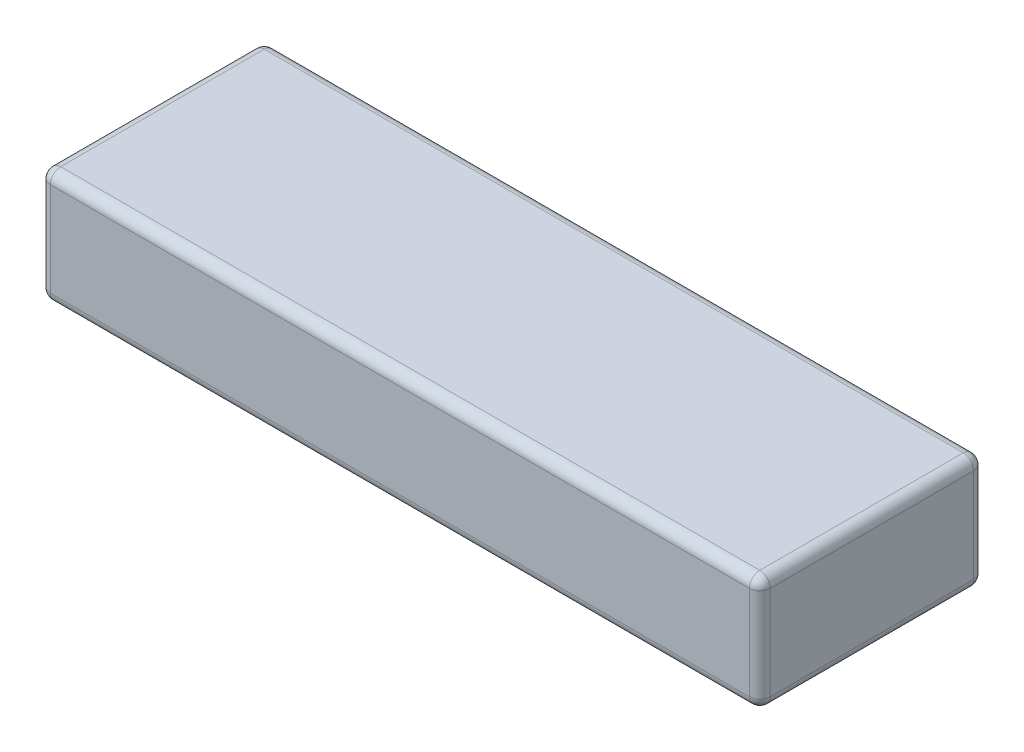
ISO-10303-21;
HEADER;
FILE_DESCRIPTION(('STEP AP214'),'2;1');
FILE_NAME('part.step','',(''),(''),'','','');
FILE_SCHEMA(('AUTOMOTIVE_DESIGN { 1 0 10303 214 1 1 1 1 }'));
ENDSEC;
DATA;
#1=APPLICATION_CONTEXT('core data for automotive mechanical design processes');
#2=APPLICATION_PROTOCOL_DEFINITION('international standard','automotive_design',2000,#1);
#3=PRODUCT_CONTEXT('',#1,'mechanical');
#4=PRODUCT('Part','Part','',(#3));
#5=PRODUCT_RELATED_PRODUCT_CATEGORY('part','',(#4));
#6=PRODUCT_DEFINITION_FORMATION('','',#4);
#7=PRODUCT_DEFINITION_CONTEXT('part definition',#1,'design');
#8=PRODUCT_DEFINITION('design','',#6,#7);
#9=PRODUCT_DEFINITION_SHAPE('','',#8);
#10=(LENGTH_UNIT() NAMED_UNIT(*) SI_UNIT(.MILLI.,.METRE.));
#11=(NAMED_UNIT(*) PLANE_ANGLE_UNIT() SI_UNIT($,.RADIAN.));
#12=(NAMED_UNIT(*) SI_UNIT($,.STERADIAN.) SOLID_ANGLE_UNIT());
#13=UNCERTAINTY_MEASURE_WITH_UNIT(LENGTH_MEASURE(1.E-05),#10,'distance_accuracy_value','');
#14=(GEOMETRIC_REPRESENTATION_CONTEXT(3) GLOBAL_UNCERTAINTY_ASSIGNED_CONTEXT((#13)) GLOBAL_UNIT_ASSIGNED_CONTEXT((#10,
#11,#12)) REPRESENTATION_CONTEXT('',''));
#15=CARTESIAN_POINT('',(0.,0.,0.));
#16=DIRECTION('',(0.,0.,1.));
#17=DIRECTION('',(1.,0.,0.));
#18=AXIS2_PLACEMENT_3D('',#15,#16,#17);
#19=CARTESIAN_POINT('',(69.,22.,21.5));
#20=DIRECTION('',(-1.,0.,0.));
#21=DIRECTION('',(0.,0.,1.));
#22=AXIS2_PLACEMENT_3D('',#19,#20,#21);
#23=PLANE('',#22);
#24=DIRECTION('',(0.,-1.,0.));
#25=VECTOR('',#24,1.);
#26=CARTESIAN_POINT('',(69.,22.,19.5));
#27=LINE('',#26,#25);
#28=CARTESIAN_POINT('',(69.,20.,19.5));
#29=VERTEX_POINT('',#28);
#30=CARTESIAN_POINT('',(69.,2.,19.5));
#31=VERTEX_POINT('',#30);
#32=EDGE_CURVE('E133',#29,#31,#27,.T.);
#33=ORIENTED_EDGE('',*,*,#32,.T.);
#34=DIRECTION('',(0.,0.,-1.));
#35=VECTOR('',#34,1.);
#36=CARTESIAN_POINT('',(69.,2.,-21.5));
#37=LINE('',#36,#35);
#38=CARTESIAN_POINT('',(69.,2.,-19.5));
#39=VERTEX_POINT('',#38);
#40=EDGE_CURVE('E129',#31,#39,#37,.T.);
#41=ORIENTED_EDGE('',*,*,#40,.T.);
#42=DIRECTION('',(0.,-1.,0.));
#43=VECTOR('',#42,1.);
#44=CARTESIAN_POINT('',(69.,22.,-19.5));
#45=LINE('',#44,#43);
#46=CARTESIAN_POINT('',(69.,20.,-19.5));
#47=VERTEX_POINT('',#46);
#48=EDGE_CURVE('E124',#39,#47,#45,.F.);
#49=ORIENTED_EDGE('',*,*,#48,.T.);
#50=DIRECTION('',(0.,0.,-1.));
#51=VECTOR('',#50,1.);
#52=CARTESIAN_POINT('',(69.,20.,21.5));
#53=LINE('',#52,#51);
#54=EDGE_CURVE('E126',#47,#29,#53,.F.);
#55=ORIENTED_EDGE('',*,*,#54,.T.);
#56=EDGE_LOOP('',(#33,#41,#49,#55));
#57=FACE_BOUND('',#56,.T.);
#58=ADVANCED_FACE('F32',(#57),#23,.F.);
#59=CARTESIAN_POINT('',(-69.,22.,-21.5));
#60=DIRECTION('',(0.,0.,1.));
#61=DIRECTION('',(1.,0.,0.));
#62=AXIS2_PLACEMENT_3D('',#59,#60,#61);
#63=PLANE('',#62);
#64=DIRECTION('',(0.,-1.,0.));
#65=VECTOR('',#64,1.);
#66=CARTESIAN_POINT('',(67.,22.,-21.5));
#67=LINE('',#66,#65);
#68=CARTESIAN_POINT('',(67.,20.,-21.5));
#69=VERTEX_POINT('',#68);
#70=CARTESIAN_POINT('',(67.,2.,-21.5));
#71=VERTEX_POINT('',#70);
#72=EDGE_CURVE('E148',#69,#71,#67,.T.);
#73=ORIENTED_EDGE('',*,*,#72,.T.);
#74=DIRECTION('',(-1.,0.,0.));
#75=VECTOR('',#74,1.);
#76=CARTESIAN_POINT('',(-69.,2.,-21.5));
#77=LINE('',#76,#75);
#78=CARTESIAN_POINT('',(-67.,2.,-21.5));
#79=VERTEX_POINT('',#78);
#80=EDGE_CURVE('E272',#71,#79,#77,.T.);
#81=ORIENTED_EDGE('',*,*,#80,.T.);
#82=DIRECTION('',(0.,-1.,0.));
#83=VECTOR('',#82,1.);
#84=CARTESIAN_POINT('',(-67.,22.,-21.5));
#85=LINE('',#84,#83);
#86=CARTESIAN_POINT('',(-67.,20.,-21.5));
#87=VERTEX_POINT('',#86);
#88=EDGE_CURVE('E270',#79,#87,#85,.F.);
#89=ORIENTED_EDGE('',*,*,#88,.T.);
#90=DIRECTION('',(-1.,0.,0.));
#91=VECTOR('',#90,1.);
#92=CARTESIAN_POINT('',(-69.,20.,-21.5));
#93=LINE('',#92,#91);
#94=EDGE_CURVE('E263',#87,#69,#93,.F.);
#95=ORIENTED_EDGE('',*,*,#94,.T.);
#96=EDGE_LOOP('',(#73,#81,#89,#95));
#97=FACE_BOUND('',#96,.T.);
#98=ADVANCED_FACE('F315',(#97),#63,.F.);
#99=CARTESIAN_POINT('',(-69.,22.,21.5));
#100=DIRECTION('',(1.,0.,0.));
#101=DIRECTION('',(0.,0.,-1.));
#102=AXIS2_PLACEMENT_3D('',#99,#100,#101);
#103=PLANE('',#102);
#104=DIRECTION('',(0.,-1.,0.));
#105=VECTOR('',#104,1.);
#106=CARTESIAN_POINT('',(-69.,22.,-19.5));
#107=LINE('',#106,#105);
#108=CARTESIAN_POINT('',(-69.,20.,-19.5));
#109=VERTEX_POINT('',#108);
#110=CARTESIAN_POINT('',(-69.,2.,-19.5));
#111=VERTEX_POINT('',#110);
#112=EDGE_CURVE('E277',#109,#111,#107,.T.);
#113=ORIENTED_EDGE('',*,*,#112,.T.);
#114=DIRECTION('',(0.,0.,1.));
#115=VECTOR('',#114,1.);
#116=CARTESIAN_POINT('',(-69.,2.,21.5));
#117=LINE('',#116,#115);
#118=CARTESIAN_POINT('',(-69.,2.,19.5));
#119=VERTEX_POINT('',#118);
#120=EDGE_CURVE('E280',#111,#119,#117,.T.);
#121=ORIENTED_EDGE('',*,*,#120,.T.);
#122=DIRECTION('',(0.,-1.,0.));
#123=VECTOR('',#122,1.);
#124=CARTESIAN_POINT('',(-69.,22.,19.5));
#125=LINE('',#124,#123);
#126=CARTESIAN_POINT('',(-69.,20.,19.5));
#127=VERTEX_POINT('',#126);
#128=EDGE_CURVE('E208',#119,#127,#125,.F.);
#129=ORIENTED_EDGE('',*,*,#128,.T.);
#130=DIRECTION('',(0.,0.,1.));
#131=VECTOR('',#130,1.);
#132=CARTESIAN_POINT('',(-69.,20.,21.5));
#133=LINE('',#132,#131);
#134=EDGE_CURVE('E275',#127,#109,#133,.F.);
#135=ORIENTED_EDGE('',*,*,#134,.T.);
#136=EDGE_LOOP('',(#113,#121,#129,#135));
#137=FACE_BOUND('',#136,.T.);
#138=ADVANCED_FACE('F296',(#137),#103,.F.);
#139=CARTESIAN_POINT('',(-69.,22.,21.5));
#140=DIRECTION('',(0.,0.,-1.));
#141=DIRECTION('',(-1.,0.,0.));
#142=AXIS2_PLACEMENT_3D('',#139,#140,#141);
#143=PLANE('',#142);
#144=DIRECTION('',(0.,-1.,0.));
#145=VECTOR('',#144,1.);
#146=CARTESIAN_POINT('',(-67.,22.,21.5));
#147=LINE('',#146,#145);
#148=CARTESIAN_POINT('',(-67.,20.,21.5));
#149=VERTEX_POINT('',#148);
#150=CARTESIAN_POINT('',(-67.,2.,21.5));
#151=VERTEX_POINT('',#150);
#152=EDGE_CURVE('E210',#149,#151,#147,.T.);
#153=ORIENTED_EDGE('',*,*,#152,.T.);
#154=DIRECTION('',(1.,0.,0.));
#155=VECTOR('',#154,1.);
#156=CARTESIAN_POINT('',(69.,2.,21.5));
#157=LINE('',#156,#155);
#158=CARTESIAN_POINT('',(67.,2.,21.5));
#159=VERTEX_POINT('',#158);
#160=EDGE_CURVE('E214',#151,#159,#157,.T.);
#161=ORIENTED_EDGE('',*,*,#160,.T.);
#162=DIRECTION('',(0.,-1.,0.));
#163=VECTOR('',#162,1.);
#164=CARTESIAN_POINT('',(67.,22.,21.5));
#165=LINE('',#164,#163);
#166=CARTESIAN_POINT('',(67.,20.,21.5));
#167=VERTEX_POINT('',#166);
#168=EDGE_CURVE('E215',#159,#167,#165,.F.);
#169=ORIENTED_EDGE('',*,*,#168,.T.);
#170=DIRECTION('',(1.,0.,0.));
#171=VECTOR('',#170,1.);
#172=CARTESIAN_POINT('',(-69.,20.,21.5));
#173=LINE('',#172,#171);
#174=EDGE_CURVE('E219',#167,#149,#173,.F.);
#175=ORIENTED_EDGE('',*,*,#174,.T.);
#176=EDGE_LOOP('',(#153,#161,#169,#175));
#177=FACE_BOUND('',#176,.T.);
#178=ADVANCED_FACE('F282',(#177),#143,.F.);
#179=CARTESIAN_POINT('',(0.,22.,0.));
#180=DIRECTION('',(0.,-1.,0.));
#181=DIRECTION('',(0.,0.,-1.));
#182=AXIS2_PLACEMENT_3D('',#179,#180,#181);
#183=PLANE('',#182);
#184=DIRECTION('',(1.,0.,0.));
#185=VECTOR('',#184,1.);
#186=CARTESIAN_POINT('',(0.,22.,19.5));
#187=LINE('',#186,#185);
#188=CARTESIAN_POINT('',(-67.,22.,19.5));
#189=VERTEX_POINT('',#188);
#190=CARTESIAN_POINT('',(67.,22.,19.5));
#191=VERTEX_POINT('',#190);
#192=EDGE_CURVE('E217',#189,#191,#187,.T.);
#193=ORIENTED_EDGE('',*,*,#192,.T.);
#194=DIRECTION('',(0.,0.,-1.));
#195=VECTOR('',#194,1.);
#196=CARTESIAN_POINT('',(67.,22.,0.));
#197=LINE('',#196,#195);
#198=CARTESIAN_POINT('',(67.,22.,-19.5));
#199=VERTEX_POINT('',#198);
#200=EDGE_CURVE('E11',#191,#199,#197,.T.);
#201=ORIENTED_EDGE('',*,*,#200,.T.);
#202=DIRECTION('',(-1.,0.,0.));
#203=VECTOR('',#202,1.);
#204=CARTESIAN_POINT('',(0.,22.,-19.5));
#205=LINE('',#204,#203);
#206=CARTESIAN_POINT('',(-67.,22.,-19.5));
#207=VERTEX_POINT('',#206);
#208=EDGE_CURVE('E41',#199,#207,#205,.T.);
#209=ORIENTED_EDGE('',*,*,#208,.T.);
#210=DIRECTION('',(0.,0.,1.));
#211=VECTOR('',#210,1.);
#212=CARTESIAN_POINT('',(-67.,22.,0.));
#213=LINE('',#212,#211);
#214=EDGE_CURVE('E224',#207,#189,#213,.T.);
#215=ORIENTED_EDGE('',*,*,#214,.T.);
#216=EDGE_LOOP('',(#193,#201,#209,#215));
#217=FACE_BOUND('',#216,.T.);
#218=ADVANCED_FACE('F286',(#217),#183,.F.);
#219=CARTESIAN_POINT('',(0.,0.,0.));
#220=DIRECTION('',(0.,-1.,0.));
#221=DIRECTION('',(0.,0.,-1.));
#222=AXIS2_PLACEMENT_3D('',#219,#220,#221);
#223=PLANE('',#222);
#224=DIRECTION('',(-1.,0.,0.));
#225=VECTOR('',#224,1.);
#226=CARTESIAN_POINT('',(69.,0.,-19.5));
#227=LINE('',#226,#225);
#228=CARTESIAN_POINT('',(-67.,0.,-19.5));
#229=VERTEX_POINT('',#228);
#230=CARTESIAN_POINT('',(67.,0.,-19.5));
#231=VERTEX_POINT('',#230);
#232=EDGE_CURVE('E259',#229,#231,#227,.F.);
#233=ORIENTED_EDGE('',*,*,#232,.T.);
#234=DIRECTION('',(0.,0.,-1.));
#235=VECTOR('',#234,1.);
#236=CARTESIAN_POINT('',(67.,0.,21.5));
#237=LINE('',#236,#235);
#238=CARTESIAN_POINT('',(67.,0.,19.5));
#239=VERTEX_POINT('',#238);
#240=EDGE_CURVE('E256',#231,#239,#237,.F.);
#241=ORIENTED_EDGE('',*,*,#240,.T.);
#242=DIRECTION('',(1.,0.,0.));
#243=VECTOR('',#242,1.);
#244=CARTESIAN_POINT('',(-69.,0.,19.5));
#245=LINE('',#244,#243);
#246=CARTESIAN_POINT('',(-67.,0.,19.5));
#247=VERTEX_POINT('',#246);
#248=EDGE_CURVE('E248',#239,#247,#245,.F.);
#249=ORIENTED_EDGE('',*,*,#248,.T.);
#250=DIRECTION('',(0.,0.,1.));
#251=VECTOR('',#250,1.);
#252=CARTESIAN_POINT('',(-67.,0.,-21.5));
#253=LINE('',#252,#251);
#254=EDGE_CURVE('E253',#247,#229,#253,.F.);
#255=ORIENTED_EDGE('',*,*,#254,.T.);
#256=EDGE_LOOP('',(#233,#241,#249,#255));
#257=FACE_BOUND('',#256,.T.);
#258=ADVANCED_FACE('F257',(#257),#223,.T.);
#259=CARTESIAN_POINT('',(-67.,20.,0.));
#260=DIRECTION('',(0.,0.,1.));
#261=DIRECTION('',(1.,0.,0.));
#262=AXIS2_PLACEMENT_3D('',#259,#260,#261);
#263=CYLINDRICAL_SURFACE('',#262,2.);
#264=CARTESIAN_POINT('',(-67.,20.,19.5));
#265=DIRECTION('',(0.,0.,1.));
#266=DIRECTION('',(1.,0.,0.));
#267=AXIS2_PLACEMENT_3D('',#264,#265,#266);
#268=CIRCLE('',#267,2.);
#269=EDGE_CURVE('E36',#189,#127,#268,.T.);
#270=ORIENTED_EDGE('',*,*,#269,.F.);
#271=ORIENTED_EDGE('',*,*,#214,.F.);
#272=CARTESIAN_POINT('',(-67.,20.,-19.5));
#273=DIRECTION('',(0.,0.,-1.));
#274=DIRECTION('',(-1.,0.,0.));
#275=AXIS2_PLACEMENT_3D('',#272,#273,#274);
#276=CIRCLE('',#275,2.);
#277=EDGE_CURVE('E188',#109,#207,#276,.T.);
#278=ORIENTED_EDGE('',*,*,#277,.F.);
#279=ORIENTED_EDGE('',*,*,#134,.F.);
#280=EDGE_LOOP('',(#270,#271,#278,#279));
#281=FACE_BOUND('',#280,.T.);
#282=ADVANCED_FACE('F34',(#281),#263,.T.);
#283=CARTESIAN_POINT('',(-67.,20.,19.5));
#284=DIRECTION('',(0.,0.,1.));
#285=DIRECTION('',(1.,0.,0.));
#286=AXIS2_PLACEMENT_3D('',#283,#284,#285);
#287=SPHERICAL_SURFACE('',#286,2.);
#288=CARTESIAN_POINT('',(-67.,20.,19.5));
#289=DIRECTION('',(-1.,0.,0.));
#290=DIRECTION('',(0.,0.,1.));
#291=AXIS2_PLACEMENT_3D('',#288,#289,#290);
#292=CIRCLE('',#291,2.);
#293=EDGE_CURVE('E183',#189,#149,#292,.F.);
#294=ORIENTED_EDGE('',*,*,#293,.F.);
#295=ORIENTED_EDGE('',*,*,#269,.T.);
#296=CARTESIAN_POINT('',(-67.,20.,19.5));
#297=DIRECTION('',(0.,1.,0.));
#298=DIRECTION('',(0.,0.,1.));
#299=AXIS2_PLACEMENT_3D('',#296,#297,#298);
#300=CIRCLE('',#299,2.);
#301=EDGE_CURVE('E186',#149,#127,#300,.F.);
#302=ORIENTED_EDGE('',*,*,#301,.F.);
#303=EDGE_LOOP('',(#294,#295,#302));
#304=FACE_BOUND('',#303,.T.);
#305=ADVANCED_FACE('F199',(#304),#287,.T.);
#306=CARTESIAN_POINT('',(-67.,20.,-19.5));
#307=DIRECTION('',(0.,0.,1.));
#308=DIRECTION('',(1.,0.,0.));
#309=AXIS2_PLACEMENT_3D('',#306,#307,#308);
#310=SPHERICAL_SURFACE('',#309,2.);
#311=CARTESIAN_POINT('',(-67.,20.,-19.5));
#312=DIRECTION('',(0.,1.,0.));
#313=DIRECTION('',(0.,0.,1.));
#314=AXIS2_PLACEMENT_3D('',#311,#312,#313);
#315=CIRCLE('',#314,2.);
#316=EDGE_CURVE('E177',#109,#87,#315,.F.);
#317=ORIENTED_EDGE('',*,*,#316,.F.);
#318=ORIENTED_EDGE('',*,*,#277,.T.);
#319=CARTESIAN_POINT('',(-67.,20.,-19.5));
#320=DIRECTION('',(-1.,0.,0.));
#321=DIRECTION('',(0.,0.,1.));
#322=AXIS2_PLACEMENT_3D('',#319,#320,#321);
#323=CIRCLE('',#322,2.);
#324=EDGE_CURVE('E180',#87,#207,#323,.F.);
#325=ORIENTED_EDGE('',*,*,#324,.F.);
#326=EDGE_LOOP('',(#317,#318,#325));
#327=FACE_BOUND('',#326,.T.);
#328=ADVANCED_FACE('F288',(#327),#310,.T.);
#329=CARTESIAN_POINT('',(-67.,22.,19.5));
#330=DIRECTION('',(0.,-1.,0.));
#331=DIRECTION('',(0.,0.,-1.));
#332=AXIS2_PLACEMENT_3D('',#329,#330,#331);
#333=CYLINDRICAL_SURFACE('',#332,2.);
#334=ORIENTED_EDGE('',*,*,#301,.T.);
#335=ORIENTED_EDGE('',*,*,#128,.F.);
#336=CARTESIAN_POINT('',(-67.,2.,19.5));
#337=DIRECTION('',(0.,-1.,0.));
#338=DIRECTION('',(0.,0.,-1.));
#339=AXIS2_PLACEMENT_3D('',#336,#337,#338);
#340=CIRCLE('',#339,2.);
#341=EDGE_CURVE('E172',#151,#119,#340,.T.);
#342=ORIENTED_EDGE('',*,*,#341,.F.);
#343=ORIENTED_EDGE('',*,*,#152,.F.);
#344=EDGE_LOOP('',(#334,#335,#342,#343));
#345=FACE_BOUND('',#344,.T.);
#346=ADVANCED_FACE('F206',(#345),#333,.T.);
#347=CARTESIAN_POINT('',(0.,20.,19.5));
#348=DIRECTION('',(1.,0.,0.));
#349=DIRECTION('',(0.,0.,-1.));
#350=AXIS2_PLACEMENT_3D('',#347,#348,#349);
#351=CYLINDRICAL_SURFACE('',#350,2.);
#352=ORIENTED_EDGE('',*,*,#293,.T.);
#353=ORIENTED_EDGE('',*,*,#174,.F.);
#354=CARTESIAN_POINT('',(67.,20.,19.5));
#355=DIRECTION('',(1.,0.,0.));
#356=DIRECTION('',(0.,0.,-1.));
#357=AXIS2_PLACEMENT_3D('',#354,#355,#356);
#358=CIRCLE('',#357,2.);
#359=EDGE_CURVE('E169',#191,#167,#358,.T.);
#360=ORIENTED_EDGE('',*,*,#359,.F.);
#361=ORIENTED_EDGE('',*,*,#192,.F.);
#362=EDGE_LOOP('',(#352,#353,#360,#361));
#363=FACE_BOUND('',#362,.T.);
#364=ADVANCED_FACE('F285',(#363),#351,.T.);
#365=CARTESIAN_POINT('',(67.,20.,0.));
#366=DIRECTION('',(0.,0.,-1.));
#367=DIRECTION('',(-1.,0.,0.));
#368=AXIS2_PLACEMENT_3D('',#365,#366,#367);
#369=CYLINDRICAL_SURFACE('',#368,2.);
#370=CARTESIAN_POINT('',(67.,20.,-19.5));
#371=DIRECTION('',(0.,0.,-1.));
#372=DIRECTION('',(-1.,0.,0.));
#373=AXIS2_PLACEMENT_3D('',#370,#371,#372);
#374=CIRCLE('',#373,2.);
#375=EDGE_CURVE('E138',#199,#47,#374,.T.);
#376=ORIENTED_EDGE('',*,*,#375,.F.);
#377=ORIENTED_EDGE('',*,*,#200,.F.);
#378=CARTESIAN_POINT('',(67.,20.,19.5));
#379=DIRECTION('',(0.,0.,1.));
#380=DIRECTION('',(1.,0.,0.));
#381=AXIS2_PLACEMENT_3D('',#378,#379,#380);
#382=CIRCLE('',#381,2.);
#383=EDGE_CURVE('E140',#29,#191,#382,.T.);
#384=ORIENTED_EDGE('',*,*,#383,.F.);
#385=ORIENTED_EDGE('',*,*,#54,.F.);
#386=EDGE_LOOP('',(#376,#377,#384,#385));
#387=FACE_BOUND('',#386,.T.);
#388=ADVANCED_FACE('F136',(#387),#369,.T.);
#389=CARTESIAN_POINT('',(0.,20.,-19.5));
#390=DIRECTION('',(-1.,0.,0.));
#391=DIRECTION('',(0.,0.,1.));
#392=AXIS2_PLACEMENT_3D('',#389,#390,#391);
#393=CYLINDRICAL_SURFACE('',#392,2.);
#394=ORIENTED_EDGE('',*,*,#324,.T.);
#395=ORIENTED_EDGE('',*,*,#208,.F.);
#396=CARTESIAN_POINT('',(67.,20.,-19.5));
#397=DIRECTION('',(1.,0.,0.));
#398=DIRECTION('',(0.,0.,-1.));
#399=AXIS2_PLACEMENT_3D('',#396,#397,#398);
#400=CIRCLE('',#399,2.);
#401=EDGE_CURVE('E49',#69,#199,#400,.T.);
#402=ORIENTED_EDGE('',*,*,#401,.F.);
#403=ORIENTED_EDGE('',*,*,#94,.F.);
#404=EDGE_LOOP('',(#394,#395,#402,#403));
#405=FACE_BOUND('',#404,.T.);
#406=ADVANCED_FACE('F425',(#405),#393,.T.);
#407=CARTESIAN_POINT('',(-67.,22.,-19.5));
#408=DIRECTION('',(0.,-1.,0.));
#409=DIRECTION('',(0.,0.,-1.));
#410=AXIS2_PLACEMENT_3D('',#407,#408,#409);
#411=CYLINDRICAL_SURFACE('',#410,2.);
#412=ORIENTED_EDGE('',*,*,#316,.T.);
#413=ORIENTED_EDGE('',*,*,#88,.F.);
#414=CARTESIAN_POINT('',(-67.,2.,-19.5));
#415=DIRECTION('',(0.,-1.,0.));
#416=DIRECTION('',(0.,0.,-1.));
#417=AXIS2_PLACEMENT_3D('',#414,#415,#416);
#418=CIRCLE('',#417,2.);
#419=EDGE_CURVE('E164',#111,#79,#418,.T.);
#420=ORIENTED_EDGE('',*,*,#419,.F.);
#421=ORIENTED_EDGE('',*,*,#112,.F.);
#422=EDGE_LOOP('',(#412,#413,#420,#421));
#423=FACE_BOUND('',#422,.T.);
#424=ADVANCED_FACE('F293',(#423),#411,.T.);
#425=CARTESIAN_POINT('',(-67.,2.,21.5));
#426=DIRECTION('',(0.,0.,-1.));
#427=DIRECTION('',(-1.,0.,0.));
#428=AXIS2_PLACEMENT_3D('',#425,#426,#427);
#429=CYLINDRICAL_SURFACE('',#428,2.);
#430=CARTESIAN_POINT('',(-67.,2.,19.5));
#431=DIRECTION('',(0.,0.,1.));
#432=DIRECTION('',(1.,0.,0.));
#433=AXIS2_PLACEMENT_3D('',#430,#431,#432);
#434=CIRCLE('',#433,2.);
#435=EDGE_CURVE('E174',#119,#247,#434,.T.);
#436=ORIENTED_EDGE('',*,*,#435,.F.);
#437=ORIENTED_EDGE('',*,*,#120,.F.);
#438=CARTESIAN_POINT('',(-67.,2.,-19.5));
#439=DIRECTION('',(0.,0.,-1.));
#440=DIRECTION('',(-1.,0.,0.));
#441=AXIS2_PLACEMENT_3D('',#438,#439,#440);
#442=CIRCLE('',#441,2.);
#443=EDGE_CURVE('E161',#229,#111,#442,.T.);
#444=ORIENTED_EDGE('',*,*,#443,.F.);
#445=ORIENTED_EDGE('',*,*,#254,.F.);
#446=EDGE_LOOP('',(#436,#437,#444,#445));
#447=FACE_BOUND('',#446,.T.);
#448=ADVANCED_FACE('F300',(#447),#429,.T.);
#449=CARTESIAN_POINT('',(-67.,2.,19.5));
#450=DIRECTION('',(0.,0.,1.));
#451=DIRECTION('',(1.,0.,0.));
#452=AXIS2_PLACEMENT_3D('',#449,#450,#451);
#453=SPHERICAL_SURFACE('',#452,2.);
#454=ORIENTED_EDGE('',*,*,#341,.T.);
#455=ORIENTED_EDGE('',*,*,#435,.T.);
#456=CARTESIAN_POINT('',(-67.,2.,19.5));
#457=DIRECTION('',(-1.,0.,0.));
#458=DIRECTION('',(0.,0.,1.));
#459=AXIS2_PLACEMENT_3D('',#456,#457,#458);
#460=CIRCLE('',#459,2.);
#461=EDGE_CURVE('E153',#151,#247,#460,.F.);
#462=ORIENTED_EDGE('',*,*,#461,.F.);
#463=EDGE_LOOP('',(#454,#455,#462));
#464=FACE_BOUND('',#463,.T.);
#465=ADVANCED_FACE('F303',(#464),#453,.T.);
#466=CARTESIAN_POINT('',(67.,20.,19.5));
#467=DIRECTION('',(0.,0.,1.));
#468=DIRECTION('',(1.,0.,0.));
#469=AXIS2_PLACEMENT_3D('',#466,#467,#468);
#470=SPHERICAL_SURFACE('',#469,2.);
#471=ORIENTED_EDGE('',*,*,#383,.T.);
#472=ORIENTED_EDGE('',*,*,#359,.T.);
#473=CARTESIAN_POINT('',(67.,20.,19.5));
#474=DIRECTION('',(0.,1.,0.));
#475=DIRECTION('',(0.,0.,1.));
#476=AXIS2_PLACEMENT_3D('',#473,#474,#475);
#477=CIRCLE('',#476,2.);
#478=EDGE_CURVE('E149',#29,#167,#477,.F.);
#479=ORIENTED_EDGE('',*,*,#478,.F.);
#480=EDGE_LOOP('',(#471,#472,#479));
#481=FACE_BOUND('',#480,.T.);
#482=ADVANCED_FACE('F305',(#481),#470,.T.);
#483=CARTESIAN_POINT('',(67.,20.,-19.5));
#484=DIRECTION('',(0.,0.,1.));
#485=DIRECTION('',(1.,0.,0.));
#486=AXIS2_PLACEMENT_3D('',#483,#484,#485);
#487=SPHERICAL_SURFACE('',#486,2.);
#488=ORIENTED_EDGE('',*,*,#401,.T.);
#489=ORIENTED_EDGE('',*,*,#375,.T.);
#490=CARTESIAN_POINT('',(67.,20.,-19.5));
#491=DIRECTION('',(0.,1.,0.));
#492=DIRECTION('',(0.,0.,1.));
#493=AXIS2_PLACEMENT_3D('',#490,#491,#492);
#494=CIRCLE('',#493,2.);
#495=EDGE_CURVE('E144',#69,#47,#494,.F.);
#496=ORIENTED_EDGE('',*,*,#495,.F.);
#497=EDGE_LOOP('',(#488,#489,#496));
#498=FACE_BOUND('',#497,.T.);
#499=ADVANCED_FACE('F143',(#498),#487,.T.);
#500=CARTESIAN_POINT('',(-67.,2.,-19.5));
#501=DIRECTION('',(0.,0.,1.));
#502=DIRECTION('',(1.,0.,0.));
#503=AXIS2_PLACEMENT_3D('',#500,#501,#502);
#504=SPHERICAL_SURFACE('',#503,2.);
#505=ORIENTED_EDGE('',*,*,#443,.T.);
#506=ORIENTED_EDGE('',*,*,#419,.T.);
#507=CARTESIAN_POINT('',(-67.,2.,-19.5));
#508=DIRECTION('',(-1.,0.,0.));
#509=DIRECTION('',(0.,0.,1.));
#510=AXIS2_PLACEMENT_3D('',#507,#508,#509);
#511=CIRCLE('',#510,2.);
#512=EDGE_CURVE('E150',#229,#79,#511,.F.);
#513=ORIENTED_EDGE('',*,*,#512,.F.);
#514=EDGE_LOOP('',(#505,#506,#513));
#515=FACE_BOUND('',#514,.T.);
#516=ADVANCED_FACE('F345',(#515),#504,.T.);
#517=CARTESIAN_POINT('',(-69.,2.,19.5));
#518=DIRECTION('',(-1.,0.,0.));
#519=DIRECTION('',(0.,0.,1.));
#520=AXIS2_PLACEMENT_3D('',#517,#518,#519);
#521=CYLINDRICAL_SURFACE('',#520,2.);
#522=ORIENTED_EDGE('',*,*,#461,.T.);
#523=ORIENTED_EDGE('',*,*,#248,.F.);
#524=CARTESIAN_POINT('',(67.,2.,19.5));
#525=DIRECTION('',(1.,0.,0.));
#526=DIRECTION('',(0.,0.,-1.));
#527=AXIS2_PLACEMENT_3D('',#524,#525,#526);
#528=CIRCLE('',#527,2.);
#529=EDGE_CURVE('E155',#159,#239,#528,.T.);
#530=ORIENTED_EDGE('',*,*,#529,.F.);
#531=ORIENTED_EDGE('',*,*,#160,.F.);
#532=EDGE_LOOP('',(#522,#523,#530,#531));
#533=FACE_BOUND('',#532,.T.);
#534=ADVANCED_FACE('F250',(#533),#521,.T.);
#535=CARTESIAN_POINT('',(67.,22.,19.5));
#536=DIRECTION('',(0.,-1.,0.));
#537=DIRECTION('',(0.,0.,-1.));
#538=AXIS2_PLACEMENT_3D('',#535,#536,#537);
#539=CYLINDRICAL_SURFACE('',#538,2.);
#540=ORIENTED_EDGE('',*,*,#478,.T.);
#541=ORIENTED_EDGE('',*,*,#168,.F.);
#542=CARTESIAN_POINT('',(67.,2.,19.5));
#543=DIRECTION('',(0.,-1.,0.));
#544=DIRECTION('',(0.,0.,-1.));
#545=AXIS2_PLACEMENT_3D('',#542,#543,#544);
#546=CIRCLE('',#545,2.);
#547=EDGE_CURVE('E237',#31,#159,#546,.T.);
#548=ORIENTED_EDGE('',*,*,#547,.F.);
#549=ORIENTED_EDGE('',*,*,#32,.F.);
#550=EDGE_LOOP('',(#540,#541,#548,#549));
#551=FACE_BOUND('',#550,.T.);
#552=ADVANCED_FACE('F339',(#551),#539,.T.);
#553=CARTESIAN_POINT('',(67.,22.,-19.5));
#554=DIRECTION('',(0.,-1.,0.));
#555=DIRECTION('',(0.,0.,-1.));
#556=AXIS2_PLACEMENT_3D('',#553,#554,#555);
#557=CYLINDRICAL_SURFACE('',#556,2.);
#558=ORIENTED_EDGE('',*,*,#495,.T.);
#559=ORIENTED_EDGE('',*,*,#48,.F.);
#560=CARTESIAN_POINT('',(67.,2.,-19.5));
#561=DIRECTION('',(0.,-1.,0.));
#562=DIRECTION('',(0.,0.,-1.));
#563=AXIS2_PLACEMENT_3D('',#560,#561,#562);
#564=CIRCLE('',#563,2.);
#565=EDGE_CURVE('E234',#71,#39,#564,.T.);
#566=ORIENTED_EDGE('',*,*,#565,.F.);
#567=ORIENTED_EDGE('',*,*,#72,.F.);
#568=EDGE_LOOP('',(#558,#559,#566,#567));
#569=FACE_BOUND('',#568,.T.);
#570=ADVANCED_FACE('F147',(#569),#557,.T.);
#571=CARTESIAN_POINT('',(-69.,2.,-19.5));
#572=DIRECTION('',(1.,0.,0.));
#573=DIRECTION('',(0.,0.,-1.));
#574=AXIS2_PLACEMENT_3D('',#571,#572,#573);
#575=CYLINDRICAL_SURFACE('',#574,2.);
#576=ORIENTED_EDGE('',*,*,#512,.T.);
#577=ORIENTED_EDGE('',*,*,#80,.F.);
#578=CARTESIAN_POINT('',(67.,2.,-19.5));
#579=DIRECTION('',(1.,0.,0.));
#580=DIRECTION('',(0.,0.,-1.));
#581=AXIS2_PLACEMENT_3D('',#578,#579,#580);
#582=CIRCLE('',#581,2.);
#583=EDGE_CURVE('E231',#231,#71,#582,.T.);
#584=ORIENTED_EDGE('',*,*,#583,.F.);
#585=ORIENTED_EDGE('',*,*,#232,.F.);
#586=EDGE_LOOP('',(#576,#577,#584,#585));
#587=FACE_BOUND('',#586,.T.);
#588=ADVANCED_FACE('F333',(#587),#575,.T.);
#589=CARTESIAN_POINT('',(67.,2.,19.5));
#590=DIRECTION('',(0.,0.,1.));
#591=DIRECTION('',(1.,0.,0.));
#592=AXIS2_PLACEMENT_3D('',#589,#590,#591);
#593=SPHERICAL_SURFACE('',#592,2.);
#594=ORIENTED_EDGE('',*,*,#547,.T.);
#595=ORIENTED_EDGE('',*,*,#529,.T.);
#596=CARTESIAN_POINT('',(67.,2.,19.5));
#597=DIRECTION('',(0.,0.,1.));
#598=DIRECTION('',(1.,0.,0.));
#599=AXIS2_PLACEMENT_3D('',#596,#597,#598);
#600=CIRCLE('',#599,2.);
#601=EDGE_CURVE('E229',#31,#239,#600,.F.);
#602=ORIENTED_EDGE('',*,*,#601,.F.);
#603=EDGE_LOOP('',(#594,#595,#602));
#604=FACE_BOUND('',#603,.T.);
#605=ADVANCED_FACE('F243',(#604),#593,.T.);
#606=CARTESIAN_POINT('',(67.,2.,-19.5));
#607=DIRECTION('',(0.,0.,1.));
#608=DIRECTION('',(1.,0.,0.));
#609=AXIS2_PLACEMENT_3D('',#606,#607,#608);
#610=SPHERICAL_SURFACE('',#609,2.);
#611=ORIENTED_EDGE('',*,*,#583,.T.);
#612=ORIENTED_EDGE('',*,*,#565,.T.);
#613=CARTESIAN_POINT('',(67.,2.,-19.5));
#614=DIRECTION('',(0.,0.,-1.));
#615=DIRECTION('',(-1.,0.,0.));
#616=AXIS2_PLACEMENT_3D('',#613,#614,#615);
#617=CIRCLE('',#616,2.);
#618=EDGE_CURVE('E227',#231,#39,#617,.F.);
#619=ORIENTED_EDGE('',*,*,#618,.F.);
#620=EDGE_LOOP('',(#611,#612,#619));
#621=FACE_BOUND('',#620,.T.);
#622=ADVANCED_FACE('F327',(#621),#610,.T.);
#623=CARTESIAN_POINT('',(67.,2.,21.5));
#624=DIRECTION('',(0.,0.,1.));
#625=DIRECTION('',(1.,0.,0.));
#626=AXIS2_PLACEMENT_3D('',#623,#624,#625);
#627=CYLINDRICAL_SURFACE('',#626,2.);
#628=ORIENTED_EDGE('',*,*,#601,.T.);
#629=ORIENTED_EDGE('',*,*,#240,.F.);
#630=ORIENTED_EDGE('',*,*,#618,.T.);
#631=ORIENTED_EDGE('',*,*,#40,.F.);
#632=EDGE_LOOP('',(#628,#629,#630,#631));
#633=FACE_BOUND('',#632,.T.);
#634=ADVANCED_FACE('F324',(#633),#627,.T.);
#635=CLOSED_SHELL('',(#58,#98,#138,#178,#218,#258,#282,#305,#328,#346,#364,#388,#406,#424,#448,
#465,#482,#499,#516,#534,#552,#570,#588,#605,#622,#634));
#636=MANIFOLD_SOLID_BREP('B2',#635);
#637=ADVANCED_BREP_SHAPE_REPRESENTATION('',(#18,#636),#14);
#638=SHAPE_DEFINITION_REPRESENTATION(#9,#637);
ENDSEC;
END-ISO-10303-21;
